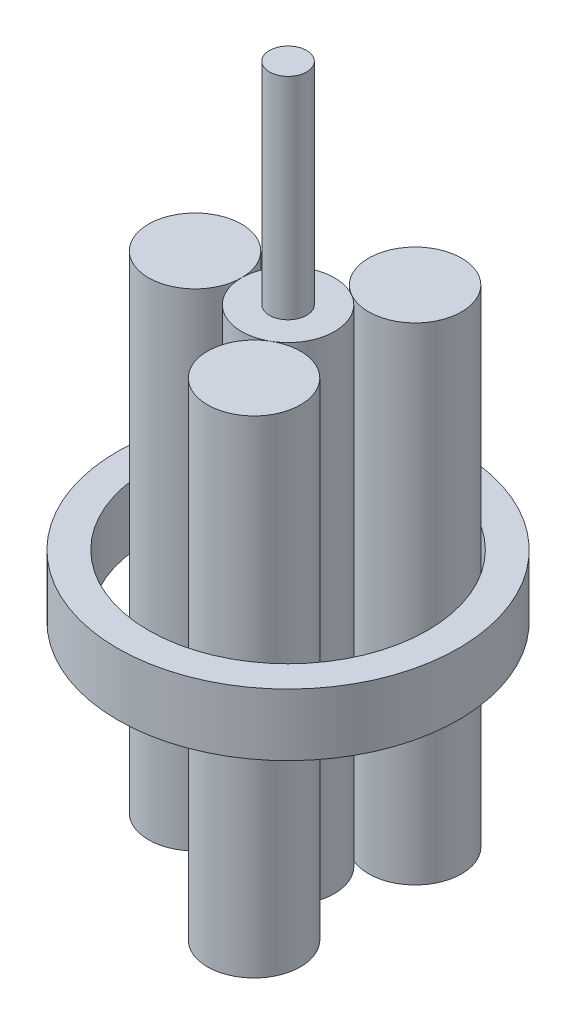
ISO-10303-21;
HEADER;
FILE_DESCRIPTION(('STEP AP214'),'2;1');
FILE_NAME('part.step','',(''),(''),'','','');
FILE_SCHEMA(('AUTOMOTIVE_DESIGN { 1 0 10303 214 1 1 1 1 }'));
ENDSEC;
DATA;
#1=APPLICATION_CONTEXT('core data for automotive mechanical design processes');
#2=APPLICATION_PROTOCOL_DEFINITION('international standard','automotive_design',2000,#1);
#3=PRODUCT_CONTEXT('',#1,'mechanical');
#4=PRODUCT('Part','Part','',(#3));
#5=PRODUCT_RELATED_PRODUCT_CATEGORY('part','',(#4));
#6=PRODUCT_DEFINITION_FORMATION('','',#4);
#7=PRODUCT_DEFINITION_CONTEXT('part definition',#1,'design');
#8=PRODUCT_DEFINITION('design','',#6,#7);
#9=PRODUCT_DEFINITION_SHAPE('','',#8);
#10=(LENGTH_UNIT() NAMED_UNIT(*) SI_UNIT(.MILLI.,.METRE.));
#11=(NAMED_UNIT(*) PLANE_ANGLE_UNIT() SI_UNIT($,.RADIAN.));
#12=(NAMED_UNIT(*) SI_UNIT($,.STERADIAN.) SOLID_ANGLE_UNIT());
#13=UNCERTAINTY_MEASURE_WITH_UNIT(LENGTH_MEASURE(1.E-05),#10,'distance_accuracy_value','');
#14=(GEOMETRIC_REPRESENTATION_CONTEXT(3) GLOBAL_UNCERTAINTY_ASSIGNED_CONTEXT((#13)) GLOBAL_UNIT_ASSIGNED_CONTEXT((#10,
#11,#12)) REPRESENTATION_CONTEXT('',''));
#15=CARTESIAN_POINT('',(0.,0.,0.));
#16=DIRECTION('',(0.,0.,1.));
#17=DIRECTION('',(1.,0.,0.));
#18=AXIS2_PLACEMENT_3D('',#15,#16,#17);
#19=CARTESIAN_POINT('',(0.,1.,0.));
#20=DIRECTION('',(0.,1.,0.));
#21=DIRECTION('',(0.,0.,1.));
#22=AXIS2_PLACEMENT_3D('',#19,#20,#21);
#23=PLANE('',#22);
#24=CARTESIAN_POINT('',(0.,1.,0.));
#25=DIRECTION('',(0.,1.,0.));
#26=DIRECTION('',(0.,0.,1.));
#27=AXIS2_PLACEMENT_3D('',#24,#25,#26);
#28=CIRCLE('',#27,5.5);
#29=CARTESIAN_POINT('',(0.,1.,5.5));
#30=VERTEX_POINT('',#29);
#31=EDGE_CURVE('E12',#30,#30,#28,.T.);
#32=ORIENTED_EDGE('',*,*,#31,.T.);
#33=EDGE_LOOP('',(#32));
#34=FACE_BOUND('',#33,.T.);
#35=CARTESIAN_POINT('',(0.,1.,0.));
#36=DIRECTION('',(0.,1.,0.));
#37=DIRECTION('',(0.,0.,1.));
#38=AXIS2_PLACEMENT_3D('',#35,#36,#37);
#39=CIRCLE('',#38,4.5);
#40=CARTESIAN_POINT('',(0.,1.,4.5));
#41=VERTEX_POINT('',#40);
#42=EDGE_CURVE('E75',#41,#41,#39,.T.);
#43=ORIENTED_EDGE('',*,*,#42,.F.);
#44=EDGE_LOOP('',(#43));
#45=FACE_BOUND('',#44,.T.);
#46=ADVANCED_FACE('F64',(#34,#45),#23,.T.);
#47=CARTESIAN_POINT('',(0.,-1.,0.));
#48=DIRECTION('',(0.,1.,0.));
#49=DIRECTION('',(0.,0.,1.));
#50=AXIS2_PLACEMENT_3D('',#47,#48,#49);
#51=PLANE('',#50);
#52=CARTESIAN_POINT('',(0.,-1.,0.));
#53=DIRECTION('',(0.,1.,0.));
#54=DIRECTION('',(0.,0.,1.));
#55=AXIS2_PLACEMENT_3D('',#52,#53,#54);
#56=CIRCLE('',#55,5.5);
#57=CARTESIAN_POINT('',(0.,-1.,5.5));
#58=VERTEX_POINT('',#57);
#59=EDGE_CURVE('E68',#58,#58,#56,.T.);
#60=ORIENTED_EDGE('',*,*,#59,.F.);
#61=EDGE_LOOP('',(#60));
#62=FACE_BOUND('',#61,.T.);
#63=CARTESIAN_POINT('',(0.,-1.,0.));
#64=DIRECTION('',(0.,1.,0.));
#65=DIRECTION('',(0.,0.,1.));
#66=AXIS2_PLACEMENT_3D('',#63,#64,#65);
#67=CIRCLE('',#66,4.5);
#68=CARTESIAN_POINT('',(0.,-1.,4.5));
#69=VERTEX_POINT('',#68);
#70=EDGE_CURVE('E77',#69,#69,#67,.T.);
#71=ORIENTED_EDGE('',*,*,#70,.T.);
#72=EDGE_LOOP('',(#71));
#73=FACE_BOUND('',#72,.T.);
#74=ADVANCED_FACE('F87',(#62,#73),#51,.F.);
#75=CARTESIAN_POINT('',(0.,1.,0.));
#76=DIRECTION('',(0.,-1.,0.));
#77=DIRECTION('',(0.,0.,-1.));
#78=AXIS2_PLACEMENT_3D('',#75,#76,#77);
#79=CYLINDRICAL_SURFACE('',#78,5.5);
#80=ORIENTED_EDGE('',*,*,#31,.F.);
#81=EDGE_LOOP('',(#80));
#82=FACE_BOUND('',#81,.T.);
#83=ORIENTED_EDGE('',*,*,#59,.T.);
#84=EDGE_LOOP('',(#83));
#85=FACE_BOUND('',#84,.T.);
#86=ADVANCED_FACE('F66',(#82,#85),#79,.T.);
#87=CARTESIAN_POINT('',(0.,1.,0.));
#88=DIRECTION('',(0.,-1.,0.));
#89=DIRECTION('',(0.,0.,-1.));
#90=AXIS2_PLACEMENT_3D('',#87,#88,#89);
#91=CYLINDRICAL_SURFACE('',#90,4.5);
#92=ORIENTED_EDGE('',*,*,#42,.T.);
#93=EDGE_LOOP('',(#92));
#94=FACE_BOUND('',#93,.T.);
#95=ORIENTED_EDGE('',*,*,#70,.F.);
#96=EDGE_LOOP('',(#95));
#97=FACE_BOUND('',#96,.T.);
#98=ADVANCED_FACE('F83',(#94,#97),#91,.F.);
#99=CLOSED_SHELL('',(#46,#74,#86,#98));
#100=MANIFOLD_SOLID_BREP('B2',#99);
#101=CARTESIAN_POINT('',(1.50000000000001,7.85,2.59807621135331));
#102=DIRECTION('',(0.,-1.,0.));
#103=DIRECTION('',(0.,0.,-1.));
#104=AXIS2_PLACEMENT_3D('',#101,#102,#103);
#105=CYLINDRICAL_SURFACE('',#104,1.5);
#106=CARTESIAN_POINT('',(1.50000000000001,7.85,2.59807621135331));
#107=DIRECTION('',(0.,1.,0.));
#108=DIRECTION('',(0.,0.,1.));
#109=AXIS2_PLACEMENT_3D('',#106,#107,#108);
#110=CIRCLE('',#109,1.5);
#111=CARTESIAN_POINT('',(1.50000000000001,7.85,4.09807621135331));
#112=VERTEX_POINT('',#111);
#113=EDGE_CURVE('E63',#112,#112,#110,.T.);
#114=ORIENTED_EDGE('',*,*,#113,.F.);
#115=EDGE_LOOP('',(#114));
#116=FACE_BOUND('',#115,.T.);
#117=CARTESIAN_POINT('',(1.50000000000001,-7.85,2.59807621135331));
#118=DIRECTION('',(0.,1.,0.));
#119=DIRECTION('',(0.,0.,1.));
#120=AXIS2_PLACEMENT_3D('',#117,#118,#119);
#121=CIRCLE('',#120,1.5);
#122=CARTESIAN_POINT('',(1.50000000000001,-7.85,4.09807621135331));
#123=VERTEX_POINT('',#122);
#124=EDGE_CURVE('E129',#123,#123,#121,.T.);
#125=ORIENTED_EDGE('',*,*,#124,.T.);
#126=EDGE_LOOP('',(#125));
#127=FACE_BOUND('',#126,.T.);
#128=ADVANCED_FACE('F126',(#116,#127),#105,.T.);
#129=CARTESIAN_POINT('',(0.,7.85,0.));
#130=DIRECTION('',(0.,1.,0.));
#131=DIRECTION('',(0.,0.,1.));
#132=AXIS2_PLACEMENT_3D('',#129,#130,#131);
#133=PLANE('',#132);
#134=ORIENTED_EDGE('',*,*,#113,.T.);
#135=EDGE_LOOP('',(#134));
#136=FACE_BOUND('',#135,.T.);
#137=ADVANCED_FACE('F141',(#136),#133,.T.);
#138=CARTESIAN_POINT('',(0.,-7.85,0.));
#139=DIRECTION('',(0.,1.,0.));
#140=DIRECTION('',(0.,0.,1.));
#141=AXIS2_PLACEMENT_3D('',#138,#139,#140);
#142=PLANE('',#141);
#143=ORIENTED_EDGE('',*,*,#124,.F.);
#144=EDGE_LOOP('',(#143));
#145=FACE_BOUND('',#144,.T.);
#146=ADVANCED_FACE('F139',(#145),#142,.F.);
#147=CLOSED_SHELL('',(#128,#137,#146));
#148=MANIFOLD_SOLID_BREP('B7',#147);
#149=CARTESIAN_POINT('',(1.49999999999997,7.85,-2.59807621135333));
#150=DIRECTION('',(0.,-1.,0.));
#151=DIRECTION('',(0.,0.,-1.));
#152=AXIS2_PLACEMENT_3D('',#149,#150,#151);
#153=CYLINDRICAL_SURFACE('',#152,1.5);
#154=CARTESIAN_POINT('',(1.49999999999997,7.85,-2.59807621135333));
#155=DIRECTION('',(0.,1.,0.));
#156=DIRECTION('',(0.,0.,1.));
#157=AXIS2_PLACEMENT_3D('',#154,#155,#156);
#158=CIRCLE('',#157,1.5);
#159=CARTESIAN_POINT('',(1.49999999999997,7.85,-1.09807621135333));
#160=VERTEX_POINT('',#159);
#161=EDGE_CURVE('E125',#160,#160,#158,.T.);
#162=ORIENTED_EDGE('',*,*,#161,.F.);
#163=EDGE_LOOP('',(#162));
#164=FACE_BOUND('',#163,.T.);
#165=CARTESIAN_POINT('',(1.49999999999997,-7.85,-2.59807621135333));
#166=DIRECTION('',(0.,1.,0.));
#167=DIRECTION('',(0.,0.,1.));
#168=AXIS2_PLACEMENT_3D('',#165,#166,#167);
#169=CIRCLE('',#168,1.5);
#170=CARTESIAN_POINT('',(1.49999999999997,-7.85,-1.09807621135333));
#171=VERTEX_POINT('',#170);
#172=EDGE_CURVE('E178',#171,#171,#169,.T.);
#173=ORIENTED_EDGE('',*,*,#172,.T.);
#174=EDGE_LOOP('',(#173));
#175=FACE_BOUND('',#174,.T.);
#176=ADVANCED_FACE('F175',(#164,#175),#153,.T.);
#177=CARTESIAN_POINT('',(0.,7.85,0.));
#178=DIRECTION('',(0.,1.,0.));
#179=DIRECTION('',(0.,0.,1.));
#180=AXIS2_PLACEMENT_3D('',#177,#178,#179);
#181=PLANE('',#180);
#182=ORIENTED_EDGE('',*,*,#161,.T.);
#183=EDGE_LOOP('',(#182));
#184=FACE_BOUND('',#183,.T.);
#185=ADVANCED_FACE('F190',(#184),#181,.T.);
#186=CARTESIAN_POINT('',(0.,-7.85,0.));
#187=DIRECTION('',(0.,1.,0.));
#188=DIRECTION('',(0.,0.,1.));
#189=AXIS2_PLACEMENT_3D('',#186,#187,#188);
#190=PLANE('',#189);
#191=ORIENTED_EDGE('',*,*,#172,.F.);
#192=EDGE_LOOP('',(#191));
#193=FACE_BOUND('',#192,.T.);
#194=ADVANCED_FACE('F188',(#193),#190,.F.);
#195=CLOSED_SHELL('',(#176,#185,#194));
#196=MANIFOLD_SOLID_BREP('B58',#195);
#197=CARTESIAN_POINT('',(0.,7.85,0.));
#198=DIRECTION('',(0.,-1.,0.));
#199=DIRECTION('',(0.,0.,-1.));
#200=AXIS2_PLACEMENT_3D('',#197,#198,#199);
#201=CYLINDRICAL_SURFACE('',#200,1.5);
#202=CARTESIAN_POINT('',(0.,7.85,0.));
#203=DIRECTION('',(0.,1.,0.));
#204=DIRECTION('',(0.,0.,1.));
#205=AXIS2_PLACEMENT_3D('',#202,#203,#204);
#206=CIRCLE('',#205,1.5);
#207=CARTESIAN_POINT('',(0.,7.85,1.5));
#208=VERTEX_POINT('',#207);
#209=EDGE_CURVE('E230',#208,#208,#206,.T.);
#210=ORIENTED_EDGE('',*,*,#209,.F.);
#211=EDGE_LOOP('',(#210));
#212=FACE_BOUND('',#211,.T.);
#213=CARTESIAN_POINT('',(0.,-7.85,0.));
#214=DIRECTION('',(0.,1.,0.));
#215=DIRECTION('',(0.,0.,1.));
#216=AXIS2_PLACEMENT_3D('',#213,#214,#215);
#217=CIRCLE('',#216,1.5);
#218=CARTESIAN_POINT('',(0.,-7.85,1.5));
#219=VERTEX_POINT('',#218);
#220=EDGE_CURVE('E226',#219,#219,#217,.T.);
#221=ORIENTED_EDGE('',*,*,#220,.T.);
#222=EDGE_LOOP('',(#221));
#223=FACE_BOUND('',#222,.T.);
#224=ADVANCED_FACE('F223',(#212,#223),#201,.T.);
#225=CARTESIAN_POINT('',(0.,7.85,0.));
#226=DIRECTION('',(0.,1.,0.));
#227=DIRECTION('',(0.,0.,1.));
#228=AXIS2_PLACEMENT_3D('',#225,#226,#227);
#229=PLANE('',#228);
#230=CARTESIAN_POINT('',(0.,7.85,0.));
#231=DIRECTION('',(0.,1.,0.));
#232=DIRECTION('',(0.,0.,1.));
#233=AXIS2_PLACEMENT_3D('',#230,#231,#232);
#234=CIRCLE('',#233,0.6);
#235=CARTESIAN_POINT('',(0.,7.85,0.6));
#236=VERTEX_POINT('',#235);
#237=EDGE_CURVE('E174',#236,#236,#234,.T.);
#238=ORIENTED_EDGE('',*,*,#237,.F.);
#239=EDGE_LOOP('',(#238));
#240=FACE_BOUND('',#239,.T.);
#241=ORIENTED_EDGE('',*,*,#209,.T.);
#242=EDGE_LOOP('',(#241));
#243=FACE_BOUND('',#242,.T.);
#244=ADVANCED_FACE('F247',(#240,#243),#229,.T.);
#245=CARTESIAN_POINT('',(0.,-7.85,0.));
#246=DIRECTION('',(0.,1.,0.));
#247=DIRECTION('',(0.,0.,1.));
#248=AXIS2_PLACEMENT_3D('',#245,#246,#247);
#249=PLANE('',#248);
#250=ORIENTED_EDGE('',*,*,#220,.F.);
#251=EDGE_LOOP('',(#250));
#252=FACE_BOUND('',#251,.T.);
#253=ADVANCED_FACE('F244',(#252),#249,.F.);
#254=CARTESIAN_POINT('',(0.,14.65,0.));
#255=DIRECTION('',(0.,-1.,0.));
#256=DIRECTION('',(0.,0.,-1.));
#257=AXIS2_PLACEMENT_3D('',#254,#255,#256);
#258=CYLINDRICAL_SURFACE('',#257,0.6);
#259=CARTESIAN_POINT('',(0.,14.65,0.));
#260=DIRECTION('',(0.,1.,0.));
#261=DIRECTION('',(0.,0.,1.));
#262=AXIS2_PLACEMENT_3D('',#259,#260,#261);
#263=CIRCLE('',#262,0.6);
#264=CARTESIAN_POINT('',(0.,14.65,0.6));
#265=VERTEX_POINT('',#264);
#266=EDGE_CURVE('E236',#265,#265,#263,.T.);
#267=ORIENTED_EDGE('',*,*,#266,.F.);
#268=EDGE_LOOP('',(#267));
#269=FACE_BOUND('',#268,.T.);
#270=ORIENTED_EDGE('',*,*,#237,.T.);
#271=EDGE_LOOP('',(#270));
#272=FACE_BOUND('',#271,.T.);
#273=ADVANCED_FACE('F246',(#269,#272),#258,.T.);
#274=CARTESIAN_POINT('',(0.,14.65,0.));
#275=DIRECTION('',(0.,1.,0.));
#276=DIRECTION('',(0.,0.,1.));
#277=AXIS2_PLACEMENT_3D('',#274,#275,#276);
#278=PLANE('',#277);
#279=ORIENTED_EDGE('',*,*,#266,.T.);
#280=EDGE_LOOP('',(#279));
#281=FACE_BOUND('',#280,.T.);
#282=ADVANCED_FACE('F252',(#281),#278,.T.);
#283=CLOSED_SHELL('',(#224,#244,#253,#273,#282));
#284=MANIFOLD_SOLID_BREP('B120',#283);
#285=CARTESIAN_POINT('',(-3.,7.85,0.));
#286=DIRECTION('',(0.,-1.,0.));
#287=DIRECTION('',(0.,0.,-1.));
#288=AXIS2_PLACEMENT_3D('',#285,#286,#287);
#289=CYLINDRICAL_SURFACE('',#288,1.5);
#290=CARTESIAN_POINT('',(-3.,7.85,0.));
#291=DIRECTION('',(0.,1.,0.));
#292=DIRECTION('',(0.,0.,1.));
#293=AXIS2_PLACEMENT_3D('',#290,#291,#292);
#294=CIRCLE('',#293,1.5);
#295=CARTESIAN_POINT('',(-3.,7.85,1.5));
#296=VERTEX_POINT('',#295);
#297=EDGE_CURVE('E222',#296,#296,#294,.T.);
#298=ORIENTED_EDGE('',*,*,#297,.F.);
#299=EDGE_LOOP('',(#298));
#300=FACE_BOUND('',#299,.T.);
#301=CARTESIAN_POINT('',(-3.,-7.85,0.));
#302=DIRECTION('',(0.,1.,0.));
#303=DIRECTION('',(0.,0.,1.));
#304=AXIS2_PLACEMENT_3D('',#301,#302,#303);
#305=CIRCLE('',#304,1.5);
#306=CARTESIAN_POINT('',(-3.,-7.85,1.5));
#307=VERTEX_POINT('',#306);
#308=EDGE_CURVE('E287',#307,#307,#305,.T.);
#309=ORIENTED_EDGE('',*,*,#308,.T.);
#310=EDGE_LOOP('',(#309));
#311=FACE_BOUND('',#310,.T.);
#312=ADVANCED_FACE('F284',(#300,#311),#289,.T.);
#313=CARTESIAN_POINT('',(0.,7.85,0.));
#314=DIRECTION('',(0.,1.,0.));
#315=DIRECTION('',(0.,0.,1.));
#316=AXIS2_PLACEMENT_3D('',#313,#314,#315);
#317=PLANE('',#316);
#318=ORIENTED_EDGE('',*,*,#297,.T.);
#319=EDGE_LOOP('',(#318));
#320=FACE_BOUND('',#319,.T.);
#321=ADVANCED_FACE('F299',(#320),#317,.T.);
#322=CARTESIAN_POINT('',(0.,-7.85,0.));
#323=DIRECTION('',(0.,1.,0.));
#324=DIRECTION('',(0.,0.,1.));
#325=AXIS2_PLACEMENT_3D('',#322,#323,#324);
#326=PLANE('',#325);
#327=ORIENTED_EDGE('',*,*,#308,.F.);
#328=EDGE_LOOP('',(#327));
#329=FACE_BOUND('',#328,.T.);
#330=ADVANCED_FACE('F297',(#329),#326,.F.);
#331=CLOSED_SHELL('',(#312,#321,#330));
#332=MANIFOLD_SOLID_BREP('B169',#331);
#333=ADVANCED_BREP_SHAPE_REPRESENTATION('',(#18,#100,#148,#196,#284,#332),#14);
#334=SHAPE_DEFINITION_REPRESENTATION(#9,#333);
ENDSEC;
END-ISO-10303-21;
